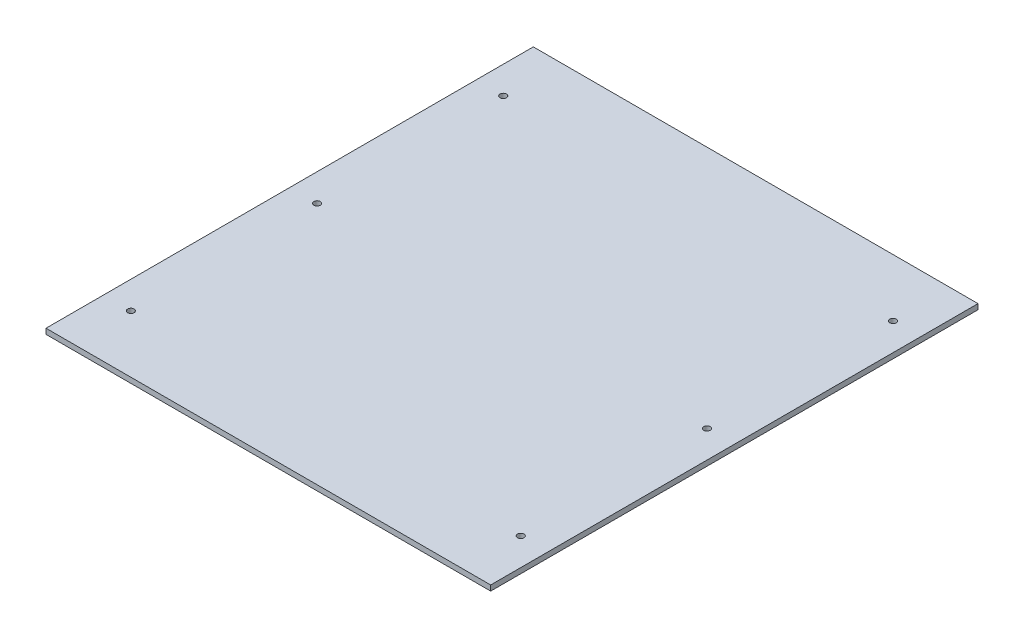
ISO-10303-21;
HEADER;
FILE_DESCRIPTION(('STEP AP214'),'2;1');
FILE_NAME('part.step','',(''),(''),'','','');
FILE_SCHEMA(('AUTOMOTIVE_DESIGN { 1 0 10303 214 1 1 1 1 }'));
ENDSEC;
DATA;
#1=APPLICATION_CONTEXT('core data for automotive mechanical design processes');
#2=APPLICATION_PROTOCOL_DEFINITION('international standard','automotive_design',2000,#1);
#3=PRODUCT_CONTEXT('',#1,'mechanical');
#4=PRODUCT('Part','Part','',(#3));
#5=PRODUCT_RELATED_PRODUCT_CATEGORY('part','',(#4));
#6=PRODUCT_DEFINITION_FORMATION('','',#4);
#7=PRODUCT_DEFINITION_CONTEXT('part definition',#1,'design');
#8=PRODUCT_DEFINITION('design','',#6,#7);
#9=PRODUCT_DEFINITION_SHAPE('','',#8);
#10=(LENGTH_UNIT() NAMED_UNIT(*) SI_UNIT(.MILLI.,.METRE.));
#11=(NAMED_UNIT(*) PLANE_ANGLE_UNIT() SI_UNIT($,.RADIAN.));
#12=(NAMED_UNIT(*) SI_UNIT($,.STERADIAN.) SOLID_ANGLE_UNIT());
#13=UNCERTAINTY_MEASURE_WITH_UNIT(LENGTH_MEASURE(1.E-05),#10,'distance_accuracy_value','');
#14=(GEOMETRIC_REPRESENTATION_CONTEXT(3) GLOBAL_UNCERTAINTY_ASSIGNED_CONTEXT((#13)) GLOBAL_UNIT_ASSIGNED_CONTEXT((#10,
#11,#12)) REPRESENTATION_CONTEXT('',''));
#15=CARTESIAN_POINT('',(0.,0.,0.));
#16=DIRECTION('',(0.,0.,1.));
#17=DIRECTION('',(1.,0.,0.));
#18=AXIS2_PLACEMENT_3D('',#15,#16,#17);
#19=CARTESIAN_POINT('',(0.,5.588,0.));
#20=DIRECTION('',(0.,-1.,0.));
#21=DIRECTION('',(0.,0.,-1.));
#22=AXIS2_PLACEMENT_3D('',#19,#20,#21);
#23=PLANE('',#22);
#24=DIRECTION('',(0.,0.,1.));
#25=VECTOR('',#24,1.);
#26=CARTESIAN_POINT('',(0.,5.588,0.));
#27=LINE('',#26,#25);
#28=CARTESIAN_POINT('',(0.,5.588,-508.));
#29=VERTEX_POINT('',#28);
#30=CARTESIAN_POINT('',(0.,5.588,0.));
#31=VERTEX_POINT('',#30);
#32=EDGE_CURVE('E85',#29,#31,#27,.T.);
#33=ORIENTED_EDGE('',*,*,#32,.T.);
#34=DIRECTION('',(1.,0.,0.));
#35=VECTOR('',#34,1.);
#36=CARTESIAN_POINT('',(0.,5.588,0.));
#37=LINE('',#36,#35);
#38=CARTESIAN_POINT('',(463.55,5.588,0.));
#39=VERTEX_POINT('',#38);
#40=EDGE_CURVE('E80',#31,#39,#37,.T.);
#41=ORIENTED_EDGE('',*,*,#40,.T.);
#42=DIRECTION('',(0.,0.,-1.));
#43=VECTOR('',#42,1.);
#44=CARTESIAN_POINT('',(463.55,5.588,0.));
#45=LINE('',#44,#43);
#46=CARTESIAN_POINT('',(463.55,5.588,-508.));
#47=VERTEX_POINT('',#46);
#48=EDGE_CURVE('E83',#39,#47,#45,.T.);
#49=ORIENTED_EDGE('',*,*,#48,.T.);
#50=DIRECTION('',(-1.,0.,0.));
#51=VECTOR('',#50,1.);
#52=CARTESIAN_POINT('',(0.,5.588,-508.));
#53=LINE('',#52,#51);
#54=EDGE_CURVE('E50',#47,#29,#53,.T.);
#55=ORIENTED_EDGE('',*,*,#54,.T.);
#56=EDGE_LOOP('',(#33,#41,#49,#55));
#57=FACE_BOUND('',#56,.T.);
#58=CARTESIAN_POINT('',(28.575,5.588,-59.944));
#59=DIRECTION('',(0.,1.,0.));
#60=DIRECTION('',(0.,0.,1.));
#61=AXIS2_PLACEMENT_3D('',#58,#59,#60);
#62=CIRCLE('',#61,3.37820000000002);
#63=CARTESIAN_POINT('',(28.575,5.588,-56.5658));
#64=VERTEX_POINT('',#63);
#65=EDGE_CURVE('E100',#64,#64,#62,.T.);
#66=ORIENTED_EDGE('',*,*,#65,.F.);
#67=EDGE_LOOP('',(#66));
#68=FACE_BOUND('',#67,.T.);
#69=CARTESIAN_POINT('',(28.575,5.588,-254.));
#70=DIRECTION('',(0.,1.,0.));
#71=DIRECTION('',(0.,0.,1.));
#72=AXIS2_PLACEMENT_3D('',#69,#70,#71);
#73=CIRCLE('',#72,3.37819999999999);
#74=CARTESIAN_POINT('',(28.575,5.588,-250.6218));
#75=VERTEX_POINT('',#74);
#76=EDGE_CURVE('E115',#75,#75,#73,.T.);
#77=ORIENTED_EDGE('',*,*,#76,.F.);
#78=EDGE_LOOP('',(#77));
#79=FACE_BOUND('',#78,.T.);
#80=CARTESIAN_POINT('',(28.575,5.588,-448.056));
#81=DIRECTION('',(0.,1.,0.));
#82=DIRECTION('',(0.,0.,1.));
#83=AXIS2_PLACEMENT_3D('',#80,#81,#82);
#84=CIRCLE('',#83,3.37819999999999);
#85=CARTESIAN_POINT('',(28.575,5.588,-444.6778));
#86=VERTEX_POINT('',#85);
#87=EDGE_CURVE('E121',#86,#86,#84,.T.);
#88=ORIENTED_EDGE('',*,*,#87,.F.);
#89=EDGE_LOOP('',(#88));
#90=FACE_BOUND('',#89,.T.);
#91=CARTESIAN_POINT('',(434.975,5.588,-448.056));
#92=DIRECTION('',(0.,1.,0.));
#93=DIRECTION('',(0.,0.,-1.));
#94=AXIS2_PLACEMENT_3D('',#91,#92,#93);
#95=CIRCLE('',#94,3.37819999999999);
#96=CARTESIAN_POINT('',(434.975,5.588,-451.4342));
#97=VERTEX_POINT('',#96);
#98=EDGE_CURVE('E127',#97,#97,#95,.T.);
#99=ORIENTED_EDGE('',*,*,#98,.F.);
#100=EDGE_LOOP('',(#99));
#101=FACE_BOUND('',#100,.T.);
#102=CARTESIAN_POINT('',(434.975,5.588,-254.));
#103=DIRECTION('',(0.,1.,0.));
#104=DIRECTION('',(0.,0.,-1.));
#105=AXIS2_PLACEMENT_3D('',#102,#103,#104);
#106=CIRCLE('',#105,3.37819999999999);
#107=CARTESIAN_POINT('',(434.975,5.588,-257.3782));
#108=VERTEX_POINT('',#107);
#109=EDGE_CURVE('E133',#108,#108,#106,.T.);
#110=ORIENTED_EDGE('',*,*,#109,.F.);
#111=EDGE_LOOP('',(#110));
#112=FACE_BOUND('',#111,.T.);
#113=CARTESIAN_POINT('',(434.975,5.588,-59.944));
#114=DIRECTION('',(0.,1.,0.));
#115=DIRECTION('',(0.,0.,-1.));
#116=AXIS2_PLACEMENT_3D('',#113,#114,#115);
#117=CIRCLE('',#116,3.37819999999999);
#118=CARTESIAN_POINT('',(434.975,5.588,-63.3222));
#119=VERTEX_POINT('',#118);
#120=EDGE_CURVE('E139',#119,#119,#117,.T.);
#121=ORIENTED_EDGE('',*,*,#120,.F.);
#122=EDGE_LOOP('',(#121));
#123=FACE_BOUND('',#122,.T.);
#124=ADVANCED_FACE('F33',(#57,#68,#79,#90,#101,#112,#123),#23,.F.);
#125=CARTESIAN_POINT('',(0.,0.,0.));
#126=DIRECTION('',(0.,-1.,0.));
#127=DIRECTION('',(0.,0.,-1.));
#128=AXIS2_PLACEMENT_3D('',#125,#126,#127);
#129=PLANE('',#128);
#130=CARTESIAN_POINT('',(434.975,0.,-254.));
#131=DIRECTION('',(0.,1.,0.));
#132=DIRECTION('',(0.,0.,-1.));
#133=AXIS2_PLACEMENT_3D('',#130,#131,#132);
#134=CIRCLE('',#133,3.37819999999999);
#135=CARTESIAN_POINT('',(434.975,0.,-257.3782));
#136=VERTEX_POINT('',#135);
#137=EDGE_CURVE('E136',#136,#136,#134,.T.);
#138=ORIENTED_EDGE('',*,*,#137,.T.);
#139=EDGE_LOOP('',(#138));
#140=FACE_BOUND('',#139,.T.);
#141=CARTESIAN_POINT('',(28.575,0.,-448.056));
#142=DIRECTION('',(0.,1.,0.));
#143=DIRECTION('',(0.,0.,1.));
#144=AXIS2_PLACEMENT_3D('',#141,#142,#143);
#145=CIRCLE('',#144,3.37819999999999);
#146=CARTESIAN_POINT('',(28.575,0.,-444.6778));
#147=VERTEX_POINT('',#146);
#148=EDGE_CURVE('E124',#147,#147,#145,.T.);
#149=ORIENTED_EDGE('',*,*,#148,.T.);
#150=EDGE_LOOP('',(#149));
#151=FACE_BOUND('',#150,.T.);
#152=CARTESIAN_POINT('',(28.575,0.,-59.944));
#153=DIRECTION('',(0.,1.,0.));
#154=DIRECTION('',(0.,0.,1.));
#155=AXIS2_PLACEMENT_3D('',#152,#153,#154);
#156=CIRCLE('',#155,3.37820000000002);
#157=CARTESIAN_POINT('',(28.575,0.,-56.5658));
#158=VERTEX_POINT('',#157);
#159=EDGE_CURVE('E112',#158,#158,#156,.T.);
#160=ORIENTED_EDGE('',*,*,#159,.T.);
#161=EDGE_LOOP('',(#160));
#162=FACE_BOUND('',#161,.T.);
#163=DIRECTION('',(0.,0.,1.));
#164=VECTOR('',#163,1.);
#165=CARTESIAN_POINT('',(0.,0.,0.));
#166=LINE('',#165,#164);
#167=CARTESIAN_POINT('',(0.,0.,-508.));
#168=VERTEX_POINT('',#167);
#169=CARTESIAN_POINT('',(0.,0.,0.));
#170=VERTEX_POINT('',#169);
#171=EDGE_CURVE('E97',#168,#170,#166,.T.);
#172=ORIENTED_EDGE('',*,*,#171,.F.);
#173=DIRECTION('',(-1.,0.,0.));
#174=VECTOR('',#173,1.);
#175=CARTESIAN_POINT('',(0.,0.,-508.));
#176=LINE('',#175,#174);
#177=CARTESIAN_POINT('',(463.55,0.,-508.));
#178=VERTEX_POINT('',#177);
#179=EDGE_CURVE('E73',#178,#168,#176,.T.);
#180=ORIENTED_EDGE('',*,*,#179,.F.);
#181=DIRECTION('',(0.,0.,-1.));
#182=VECTOR('',#181,1.);
#183=CARTESIAN_POINT('',(463.55,0.,0.));
#184=LINE('',#183,#182);
#185=CARTESIAN_POINT('',(463.55,0.,0.));
#186=VERTEX_POINT('',#185);
#187=EDGE_CURVE('E67',#186,#178,#184,.T.);
#188=ORIENTED_EDGE('',*,*,#187,.F.);
#189=DIRECTION('',(1.,0.,0.));
#190=VECTOR('',#189,1.);
#191=CARTESIAN_POINT('',(0.,0.,0.));
#192=LINE('',#191,#190);
#193=EDGE_CURVE('E89',#170,#186,#192,.T.);
#194=ORIENTED_EDGE('',*,*,#193,.F.);
#195=EDGE_LOOP('',(#172,#180,#188,#194));
#196=FACE_BOUND('',#195,.T.);
#197=CARTESIAN_POINT('',(28.575,0.,-254.));
#198=DIRECTION('',(0.,1.,0.));
#199=DIRECTION('',(0.,0.,1.));
#200=AXIS2_PLACEMENT_3D('',#197,#198,#199);
#201=CIRCLE('',#200,3.37819999999999);
#202=CARTESIAN_POINT('',(28.575,0.,-250.6218));
#203=VERTEX_POINT('',#202);
#204=EDGE_CURVE('E118',#203,#203,#201,.T.);
#205=ORIENTED_EDGE('',*,*,#204,.T.);
#206=EDGE_LOOP('',(#205));
#207=FACE_BOUND('',#206,.T.);
#208=CARTESIAN_POINT('',(434.975,0.,-448.056));
#209=DIRECTION('',(0.,1.,0.));
#210=DIRECTION('',(0.,0.,-1.));
#211=AXIS2_PLACEMENT_3D('',#208,#209,#210);
#212=CIRCLE('',#211,3.37819999999999);
#213=CARTESIAN_POINT('',(434.975,0.,-451.4342));
#214=VERTEX_POINT('',#213);
#215=EDGE_CURVE('E130',#214,#214,#212,.T.);
#216=ORIENTED_EDGE('',*,*,#215,.T.);
#217=EDGE_LOOP('',(#216));
#218=FACE_BOUND('',#217,.T.);
#219=CARTESIAN_POINT('',(434.975,0.,-59.944));
#220=DIRECTION('',(0.,1.,0.));
#221=DIRECTION('',(0.,0.,-1.));
#222=AXIS2_PLACEMENT_3D('',#219,#220,#221);
#223=CIRCLE('',#222,3.37819999999999);
#224=CARTESIAN_POINT('',(434.975,0.,-63.3222));
#225=VERTEX_POINT('',#224);
#226=EDGE_CURVE('E142',#225,#225,#223,.T.);
#227=ORIENTED_EDGE('',*,*,#226,.T.);
#228=EDGE_LOOP('',(#227));
#229=FACE_BOUND('',#228,.T.);
#230=ADVANCED_FACE('F108',(#140,#151,#162,#196,#207,#218,#229),#129,.T.);
#231=CARTESIAN_POINT('',(0.,5.588,0.));
#232=DIRECTION('',(1.,0.,0.));
#233=DIRECTION('',(0.,0.,-1.));
#234=AXIS2_PLACEMENT_3D('',#231,#232,#233);
#235=PLANE('',#234);
#236=ORIENTED_EDGE('',*,*,#171,.T.);
#237=DIRECTION('',(0.,-1.,0.));
#238=VECTOR('',#237,1.);
#239=CARTESIAN_POINT('',(0.,5.588,0.));
#240=LINE('',#239,#238);
#241=EDGE_CURVE('E11',#31,#170,#240,.T.);
#242=ORIENTED_EDGE('',*,*,#241,.F.);
#243=ORIENTED_EDGE('',*,*,#32,.F.);
#244=DIRECTION('',(0.,-1.,0.));
#245=VECTOR('',#244,1.);
#246=CARTESIAN_POINT('',(0.,5.588,-508.));
#247=LINE('',#246,#245);
#248=EDGE_CURVE('E93',#29,#168,#247,.T.);
#249=ORIENTED_EDGE('',*,*,#248,.T.);
#250=EDGE_LOOP('',(#236,#242,#243,#249));
#251=FACE_BOUND('',#250,.T.);
#252=ADVANCED_FACE('F35',(#251),#235,.F.);
#253=CARTESIAN_POINT('',(0.,5.588,0.));
#254=DIRECTION('',(0.,0.,-1.));
#255=DIRECTION('',(-1.,0.,0.));
#256=AXIS2_PLACEMENT_3D('',#253,#254,#255);
#257=PLANE('',#256);
#258=ORIENTED_EDGE('',*,*,#193,.T.);
#259=DIRECTION('',(0.,-1.,0.));
#260=VECTOR('',#259,1.);
#261=CARTESIAN_POINT('',(463.55,5.588,0.));
#262=LINE('',#261,#260);
#263=EDGE_CURVE('E42',#39,#186,#262,.T.);
#264=ORIENTED_EDGE('',*,*,#263,.F.);
#265=ORIENTED_EDGE('',*,*,#40,.F.);
#266=ORIENTED_EDGE('',*,*,#241,.T.);
#267=EDGE_LOOP('',(#258,#264,#265,#266));
#268=FACE_BOUND('',#267,.T.);
#269=ADVANCED_FACE('F88',(#268),#257,.F.);
#270=CARTESIAN_POINT('',(463.55,5.588,0.));
#271=DIRECTION('',(-1.,0.,0.));
#272=DIRECTION('',(0.,0.,1.));
#273=AXIS2_PLACEMENT_3D('',#270,#271,#272);
#274=PLANE('',#273);
#275=ORIENTED_EDGE('',*,*,#187,.T.);
#276=DIRECTION('',(0.,-1.,0.));
#277=VECTOR('',#276,1.);
#278=CARTESIAN_POINT('',(463.55,5.588,-508.));
#279=LINE('',#278,#277);
#280=EDGE_CURVE('E90',#47,#178,#279,.T.);
#281=ORIENTED_EDGE('',*,*,#280,.F.);
#282=ORIENTED_EDGE('',*,*,#48,.F.);
#283=ORIENTED_EDGE('',*,*,#263,.T.);
#284=EDGE_LOOP('',(#275,#281,#282,#283));
#285=FACE_BOUND('',#284,.T.);
#286=ADVANCED_FACE('F91',(#285),#274,.F.);
#287=CARTESIAN_POINT('',(0.,5.588,-508.));
#288=DIRECTION('',(0.,0.,1.));
#289=DIRECTION('',(1.,0.,0.));
#290=AXIS2_PLACEMENT_3D('',#287,#288,#289);
#291=PLANE('',#290);
#292=ORIENTED_EDGE('',*,*,#179,.T.);
#293=ORIENTED_EDGE('',*,*,#248,.F.);
#294=ORIENTED_EDGE('',*,*,#54,.F.);
#295=ORIENTED_EDGE('',*,*,#280,.T.);
#296=EDGE_LOOP('',(#292,#293,#294,#295));
#297=FACE_BOUND('',#296,.T.);
#298=ADVANCED_FACE('F105',(#297),#291,.F.);
#299=CARTESIAN_POINT('',(28.575,5.588,-59.944));
#300=DIRECTION('',(0.,-1.,0.));
#301=DIRECTION('',(0.,0.,-1.));
#302=AXIS2_PLACEMENT_3D('',#299,#300,#301);
#303=CYLINDRICAL_SURFACE('',#302,3.37820000000002);
#304=ORIENTED_EDGE('',*,*,#65,.T.);
#305=EDGE_LOOP('',(#304));
#306=FACE_BOUND('',#305,.T.);
#307=ORIENTED_EDGE('',*,*,#159,.F.);
#308=EDGE_LOOP('',(#307));
#309=FACE_BOUND('',#308,.T.);
#310=ADVANCED_FACE('F159',(#306,#309),#303,.F.);
#311=CARTESIAN_POINT('',(28.575,5.588,-254.));
#312=DIRECTION('',(0.,-1.,0.));
#313=DIRECTION('',(0.,0.,-1.));
#314=AXIS2_PLACEMENT_3D('',#311,#312,#313);
#315=CYLINDRICAL_SURFACE('',#314,3.37819999999999);
#316=ORIENTED_EDGE('',*,*,#76,.T.);
#317=EDGE_LOOP('',(#316));
#318=FACE_BOUND('',#317,.T.);
#319=ORIENTED_EDGE('',*,*,#204,.F.);
#320=EDGE_LOOP('',(#319));
#321=FACE_BOUND('',#320,.T.);
#322=ADVANCED_FACE('F205',(#318,#321),#315,.F.);
#323=CARTESIAN_POINT('',(28.575,5.588,-448.056));
#324=DIRECTION('',(0.,-1.,0.));
#325=DIRECTION('',(0.,0.,-1.));
#326=AXIS2_PLACEMENT_3D('',#323,#324,#325);
#327=CYLINDRICAL_SURFACE('',#326,3.37819999999999);
#328=ORIENTED_EDGE('',*,*,#87,.T.);
#329=EDGE_LOOP('',(#328));
#330=FACE_BOUND('',#329,.T.);
#331=ORIENTED_EDGE('',*,*,#148,.F.);
#332=EDGE_LOOP('',(#331));
#333=FACE_BOUND('',#332,.T.);
#334=ADVANCED_FACE('F213',(#330,#333),#327,.F.);
#335=CARTESIAN_POINT('',(434.975,5.588,-448.056));
#336=DIRECTION('',(0.,-1.,0.));
#337=DIRECTION('',(0.,0.,-1.));
#338=AXIS2_PLACEMENT_3D('',#335,#336,#337);
#339=CYLINDRICAL_SURFACE('',#338,3.37819999999999);
#340=ORIENTED_EDGE('',*,*,#98,.T.);
#341=EDGE_LOOP('',(#340));
#342=FACE_BOUND('',#341,.T.);
#343=ORIENTED_EDGE('',*,*,#215,.F.);
#344=EDGE_LOOP('',(#343));
#345=FACE_BOUND('',#344,.T.);
#346=ADVANCED_FACE('F221',(#342,#345),#339,.F.);
#347=CARTESIAN_POINT('',(434.975,5.588,-254.));
#348=DIRECTION('',(0.,-1.,0.));
#349=DIRECTION('',(0.,0.,-1.));
#350=AXIS2_PLACEMENT_3D('',#347,#348,#349);
#351=CYLINDRICAL_SURFACE('',#350,3.37819999999999);
#352=ORIENTED_EDGE('',*,*,#109,.T.);
#353=EDGE_LOOP('',(#352));
#354=FACE_BOUND('',#353,.T.);
#355=ORIENTED_EDGE('',*,*,#137,.F.);
#356=EDGE_LOOP('',(#355));
#357=FACE_BOUND('',#356,.T.);
#358=ADVANCED_FACE('F230',(#354,#357),#351,.F.);
#359=CARTESIAN_POINT('',(434.975,5.588,-59.944));
#360=DIRECTION('',(0.,-1.,0.));
#361=DIRECTION('',(0.,0.,-1.));
#362=AXIS2_PLACEMENT_3D('',#359,#360,#361);
#363=CYLINDRICAL_SURFACE('',#362,3.37819999999999);
#364=ORIENTED_EDGE('',*,*,#120,.T.);
#365=EDGE_LOOP('',(#364));
#366=FACE_BOUND('',#365,.T.);
#367=ORIENTED_EDGE('',*,*,#226,.F.);
#368=EDGE_LOOP('',(#367));
#369=FACE_BOUND('',#368,.T.);
#370=ADVANCED_FACE('F148',(#366,#369),#363,.F.);
#371=CLOSED_SHELL('',(#124,#230,#252,#269,#286,#298,#310,#322,#334,#346,#358,#370));
#372=MANIFOLD_SOLID_BREP('B2',#371);
#373=ADVANCED_BREP_SHAPE_REPRESENTATION('',(#18,#372),#14);
#374=SHAPE_DEFINITION_REPRESENTATION(#9,#373);
ENDSEC;
END-ISO-10303-21;
